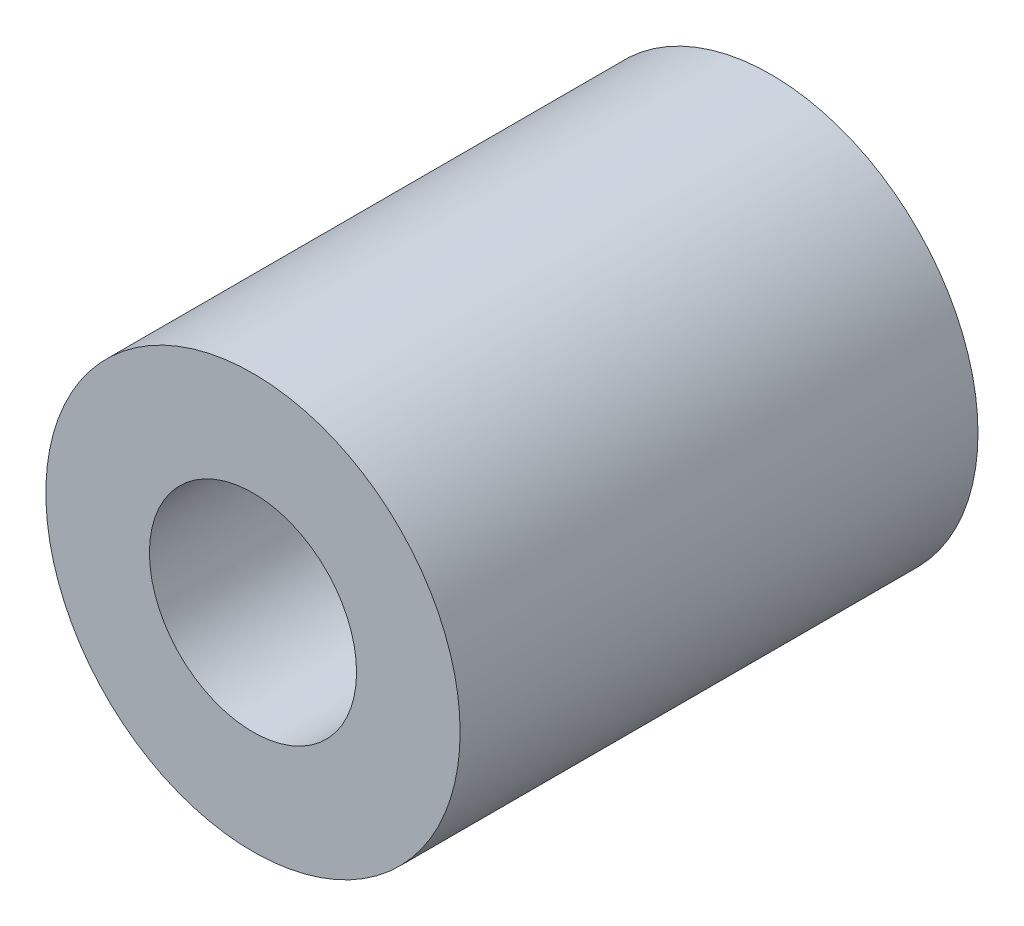
ISO-10303-21;
HEADER;
FILE_DESCRIPTION(('STEP AP214'),'2;1');
FILE_NAME('part.step','',(''),(''),'','','');
FILE_SCHEMA(('AUTOMOTIVE_DESIGN { 1 0 10303 214 1 1 1 1 }'));
ENDSEC;
DATA;
#1=APPLICATION_CONTEXT('core data for automotive mechanical design processes');
#2=APPLICATION_PROTOCOL_DEFINITION('international standard','automotive_design',2000,#1);
#3=PRODUCT_CONTEXT('',#1,'mechanical');
#4=PRODUCT('Part','Part','',(#3));
#5=PRODUCT_RELATED_PRODUCT_CATEGORY('part','',(#4));
#6=PRODUCT_DEFINITION_FORMATION('','',#4);
#7=PRODUCT_DEFINITION_CONTEXT('part definition',#1,'design');
#8=PRODUCT_DEFINITION('design','',#6,#7);
#9=PRODUCT_DEFINITION_SHAPE('','',#8);
#10=(LENGTH_UNIT() NAMED_UNIT(*) SI_UNIT(.MILLI.,.METRE.));
#11=(NAMED_UNIT(*) PLANE_ANGLE_UNIT() SI_UNIT($,.RADIAN.));
#12=(NAMED_UNIT(*) SI_UNIT($,.STERADIAN.) SOLID_ANGLE_UNIT());
#13=UNCERTAINTY_MEASURE_WITH_UNIT(LENGTH_MEASURE(1.E-05),#10,'distance_accuracy_value','');
#14=(GEOMETRIC_REPRESENTATION_CONTEXT(3) GLOBAL_UNCERTAINTY_ASSIGNED_CONTEXT((#13)) GLOBAL_UNIT_ASSIGNED_CONTEXT((#10,
#11,#12)) REPRESENTATION_CONTEXT('',''));
#15=CARTESIAN_POINT('',(0.,0.,0.));
#16=DIRECTION('',(0.,0.,1.));
#17=DIRECTION('',(1.,0.,0.));
#18=AXIS2_PLACEMENT_3D('',#15,#16,#17);
#19=CARTESIAN_POINT('',(0.,0.,5.));
#20=DIRECTION('',(0.,0.,1.));
#21=DIRECTION('',(1.,0.,0.));
#22=AXIS2_PLACEMENT_3D('',#19,#20,#21);
#23=PLANE('',#22);
#24=CARTESIAN_POINT('',(0.,0.,5.));
#25=DIRECTION('',(0.,0.,1.));
#26=DIRECTION('',(1.,0.,0.));
#27=AXIS2_PLACEMENT_3D('',#24,#25,#26);
#28=CIRCLE('',#27,2.);
#29=CARTESIAN_POINT('',(2.,0.,5.));
#30=VERTEX_POINT('',#29);
#31=EDGE_CURVE('E10',#30,#30,#28,.T.);
#32=ORIENTED_EDGE('',*,*,#31,.T.);
#33=EDGE_LOOP('',(#32));
#34=FACE_BOUND('',#33,.T.);
#35=CARTESIAN_POINT('',(0.,0.,5.));
#36=DIRECTION('',(0.,0.,1.));
#37=DIRECTION('',(1.,0.,0.));
#38=AXIS2_PLACEMENT_3D('',#35,#36,#37);
#39=CIRCLE('',#38,1.);
#40=CARTESIAN_POINT('',(1.,0.,5.));
#41=VERTEX_POINT('',#40);
#42=EDGE_CURVE('E42',#41,#41,#39,.T.);
#43=ORIENTED_EDGE('',*,*,#42,.F.);
#44=EDGE_LOOP('',(#43));
#45=FACE_BOUND('',#44,.T.);
#46=ADVANCED_FACE('F31',(#34,#45),#23,.T.);
#47=CARTESIAN_POINT('',(0.,0.,0.));
#48=DIRECTION('',(0.,0.,1.));
#49=DIRECTION('',(1.,0.,0.));
#50=AXIS2_PLACEMENT_3D('',#47,#48,#49);
#51=PLANE('',#50);
#52=CARTESIAN_POINT('',(0.,0.,0.));
#53=DIRECTION('',(0.,0.,1.));
#54=DIRECTION('',(1.,0.,0.));
#55=AXIS2_PLACEMENT_3D('',#52,#53,#54);
#56=CIRCLE('',#55,2.);
#57=CARTESIAN_POINT('',(2.,0.,0.));
#58=VERTEX_POINT('',#57);
#59=EDGE_CURVE('E35',#58,#58,#56,.T.);
#60=ORIENTED_EDGE('',*,*,#59,.F.);
#61=EDGE_LOOP('',(#60));
#62=FACE_BOUND('',#61,.T.);
#63=CARTESIAN_POINT('',(0.,0.,0.));
#64=DIRECTION('',(0.,0.,1.));
#65=DIRECTION('',(1.,0.,0.));
#66=AXIS2_PLACEMENT_3D('',#63,#64,#65);
#67=CIRCLE('',#66,1.);
#68=CARTESIAN_POINT('',(1.,0.,0.));
#69=VERTEX_POINT('',#68);
#70=EDGE_CURVE('E44',#69,#69,#67,.T.);
#71=ORIENTED_EDGE('',*,*,#70,.T.);
#72=EDGE_LOOP('',(#71));
#73=FACE_BOUND('',#72,.T.);
#74=ADVANCED_FACE('F54',(#62,#73),#51,.F.);
#75=CARTESIAN_POINT('',(0.,0.,5.));
#76=DIRECTION('',(0.,0.,-1.));
#77=DIRECTION('',(-1.,0.,0.));
#78=AXIS2_PLACEMENT_3D('',#75,#76,#77);
#79=CYLINDRICAL_SURFACE('',#78,2.);
#80=ORIENTED_EDGE('',*,*,#31,.F.);
#81=EDGE_LOOP('',(#80));
#82=FACE_BOUND('',#81,.T.);
#83=ORIENTED_EDGE('',*,*,#59,.T.);
#84=EDGE_LOOP('',(#83));
#85=FACE_BOUND('',#84,.T.);
#86=ADVANCED_FACE('F33',(#82,#85),#79,.T.);
#87=CARTESIAN_POINT('',(0.,0.,5.));
#88=DIRECTION('',(0.,0.,-1.));
#89=DIRECTION('',(-1.,0.,0.));
#90=AXIS2_PLACEMENT_3D('',#87,#88,#89);
#91=CYLINDRICAL_SURFACE('',#90,1.);
#92=ORIENTED_EDGE('',*,*,#42,.T.);
#93=EDGE_LOOP('',(#92));
#94=FACE_BOUND('',#93,.T.);
#95=ORIENTED_EDGE('',*,*,#70,.F.);
#96=EDGE_LOOP('',(#95));
#97=FACE_BOUND('',#96,.T.);
#98=ADVANCED_FACE('F50',(#94,#97),#91,.F.);
#99=CLOSED_SHELL('',(#46,#74,#86,#98));
#100=MANIFOLD_SOLID_BREP('B2',#99);
#101=ADVANCED_BREP_SHAPE_REPRESENTATION('',(#18,#100),#14);
#102=SHAPE_DEFINITION_REPRESENTATION(#9,#101);
ENDSEC;
END-ISO-10303-21;
